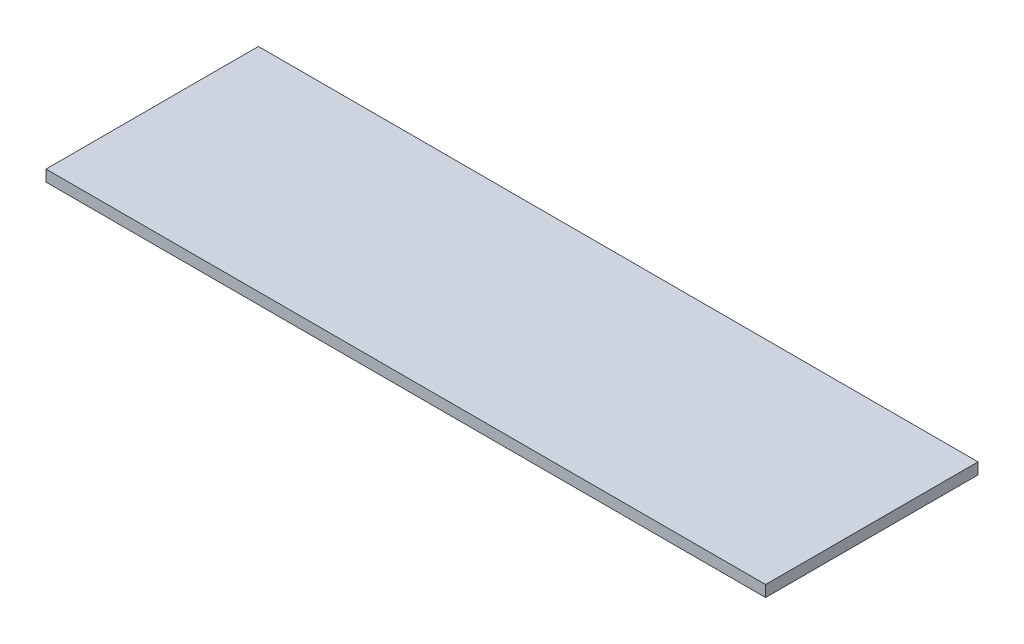
ISO-10303-21;
HEADER;
FILE_DESCRIPTION(('STEP AP214'),'2;1');
FILE_NAME('part.step','',(''),(''),'','','');
FILE_SCHEMA(('AUTOMOTIVE_DESIGN { 1 0 10303 214 1 1 1 1 }'));
ENDSEC;
DATA;
#1=APPLICATION_CONTEXT('core data for automotive mechanical design processes');
#2=APPLICATION_PROTOCOL_DEFINITION('international standard','automotive_design',2000,#1);
#3=PRODUCT_CONTEXT('',#1,'mechanical');
#4=PRODUCT('Part','Part','',(#3));
#5=PRODUCT_RELATED_PRODUCT_CATEGORY('part','',(#4));
#6=PRODUCT_DEFINITION_FORMATION('','',#4);
#7=PRODUCT_DEFINITION_CONTEXT('part definition',#1,'design');
#8=PRODUCT_DEFINITION('design','',#6,#7);
#9=PRODUCT_DEFINITION_SHAPE('','',#8);
#10=(LENGTH_UNIT() NAMED_UNIT(*) SI_UNIT(.MILLI.,.METRE.));
#11=(NAMED_UNIT(*) PLANE_ANGLE_UNIT() SI_UNIT($,.RADIAN.));
#12=(NAMED_UNIT(*) SI_UNIT($,.STERADIAN.) SOLID_ANGLE_UNIT());
#13=UNCERTAINTY_MEASURE_WITH_UNIT(LENGTH_MEASURE(1.E-05),#10,'distance_accuracy_value','');
#14=(GEOMETRIC_REPRESENTATION_CONTEXT(3) GLOBAL_UNCERTAINTY_ASSIGNED_CONTEXT((#13)) GLOBAL_UNIT_ASSIGNED_CONTEXT((#10,
#11,#12)) REPRESENTATION_CONTEXT('',''));
#15=CARTESIAN_POINT('',(0.,0.,0.));
#16=DIRECTION('',(0.,0.,1.));
#17=DIRECTION('',(1.,0.,0.));
#18=AXIS2_PLACEMENT_3D('',#15,#16,#17);
#19=CARTESIAN_POINT('',(-66.1180566751796,2.54,-8.50579229211235));
#20=DIRECTION('',(1.,0.,0.));
#21=DIRECTION('',(0.,0.,-1.));
#22=AXIS2_PLACEMENT_3D('',#19,#20,#21);
#23=PLANE('',#22);
#24=DIRECTION('',(0.,0.,1.));
#25=VECTOR('',#24,1.);
#26=CARTESIAN_POINT('',(-66.1180566751796,0.,-8.50579229211235));
#27=LINE('',#26,#25);
#28=CARTESIAN_POINT('',(-66.1180566751796,0.,-8.50579229211235));
#29=VERTEX_POINT('',#28);
#30=CARTESIAN_POINT('',(-66.1180566751795,0.,39.2287676091247));
#31=VERTEX_POINT('',#30);
#32=EDGE_CURVE('E95',#29,#31,#27,.T.);
#33=ORIENTED_EDGE('',*,*,#32,.T.);
#34=DIRECTION('',(0.,-1.,0.));
#35=VECTOR('',#34,1.);
#36=CARTESIAN_POINT('',(-66.1180566751795,2.54,39.2287676091247));
#37=LINE('',#36,#35);
#38=CARTESIAN_POINT('',(-66.1180566751795,2.54,39.2287676091247));
#39=VERTEX_POINT('',#38);
#40=EDGE_CURVE('E11',#39,#31,#37,.T.);
#41=ORIENTED_EDGE('',*,*,#40,.F.);
#42=DIRECTION('',(0.,0.,1.));
#43=VECTOR('',#42,1.);
#44=CARTESIAN_POINT('',(-66.1180566751796,2.54,-8.50579229211235));
#45=LINE('',#44,#43);
#46=CARTESIAN_POINT('',(-66.1180566751796,2.54,-8.50579229211235));
#47=VERTEX_POINT('',#46);
#48=EDGE_CURVE('E83',#47,#39,#45,.T.);
#49=ORIENTED_EDGE('',*,*,#48,.F.);
#50=DIRECTION('',(0.,-1.,0.));
#51=VECTOR('',#50,1.);
#52=CARTESIAN_POINT('',(-66.1180566751796,2.54,-8.50579229211235));
#53=LINE('',#52,#51);
#54=EDGE_CURVE('E91',#47,#29,#53,.T.);
#55=ORIENTED_EDGE('',*,*,#54,.T.);
#56=EDGE_LOOP('',(#33,#41,#49,#55));
#57=FACE_BOUND('',#56,.T.);
#58=ADVANCED_FACE('F32',(#57),#23,.F.);
#59=CARTESIAN_POINT('',(-66.1180566751795,2.54,39.2287676091247));
#60=DIRECTION('',(0.,0.,-1.));
#61=DIRECTION('',(-1.,0.,0.));
#62=AXIS2_PLACEMENT_3D('',#59,#60,#61);
#63=PLANE('',#62);
#64=DIRECTION('',(1.,0.,0.));
#65=VECTOR('',#64,1.);
#66=CARTESIAN_POINT('',(-66.1180566751795,0.,39.2287676091247));
#67=LINE('',#66,#65);
#68=CARTESIAN_POINT('',(95.5943126474986,0.,39.2287676091247));
#69=VERTEX_POINT('',#68);
#70=EDGE_CURVE('E87',#31,#69,#67,.T.);
#71=ORIENTED_EDGE('',*,*,#70,.T.);
#72=DIRECTION('',(0.,-1.,0.));
#73=VECTOR('',#72,1.);
#74=CARTESIAN_POINT('',(95.5943126474986,2.54,39.2287676091247));
#75=LINE('',#74,#73);
#76=CARTESIAN_POINT('',(95.5943126474986,2.54,39.2287676091247));
#77=VERTEX_POINT('',#76);
#78=EDGE_CURVE('E40',#77,#69,#75,.T.);
#79=ORIENTED_EDGE('',*,*,#78,.F.);
#80=DIRECTION('',(1.,0.,0.));
#81=VECTOR('',#80,1.);
#82=CARTESIAN_POINT('',(-66.1180566751795,2.54,39.2287676091247));
#83=LINE('',#82,#81);
#84=EDGE_CURVE('E78',#39,#77,#83,.T.);
#85=ORIENTED_EDGE('',*,*,#84,.F.);
#86=ORIENTED_EDGE('',*,*,#40,.T.);
#87=EDGE_LOOP('',(#71,#79,#85,#86));
#88=FACE_BOUND('',#87,.T.);
#89=ADVANCED_FACE('F86',(#88),#63,.F.);
#90=CARTESIAN_POINT('',(95.5943126474986,2.54,-8.50579229211235));
#91=DIRECTION('',(-1.,0.,0.));
#92=DIRECTION('',(0.,0.,1.));
#93=AXIS2_PLACEMENT_3D('',#90,#91,#92);
#94=PLANE('',#93);
#95=DIRECTION('',(0.,0.,-1.));
#96=VECTOR('',#95,1.);
#97=CARTESIAN_POINT('',(95.5943126474986,0.,-8.50579229211235));
#98=LINE('',#97,#96);
#99=CARTESIAN_POINT('',(95.5943126474986,0.,-8.50579229211235));
#100=VERTEX_POINT('',#99);
#101=EDGE_CURVE('E65',#69,#100,#98,.T.);
#102=ORIENTED_EDGE('',*,*,#101,.T.);
#103=DIRECTION('',(0.,-1.,0.));
#104=VECTOR('',#103,1.);
#105=CARTESIAN_POINT('',(95.5943126474986,2.54,-8.50579229211235));
#106=LINE('',#105,#104);
#107=CARTESIAN_POINT('',(95.5943126474986,2.54,-8.50579229211235));
#108=VERTEX_POINT('',#107);
#109=EDGE_CURVE('E88',#108,#100,#106,.T.);
#110=ORIENTED_EDGE('',*,*,#109,.F.);
#111=DIRECTION('',(0.,0.,-1.));
#112=VECTOR('',#111,1.);
#113=CARTESIAN_POINT('',(95.5943126474986,2.54,-8.50579229211235));
#114=LINE('',#113,#112);
#115=EDGE_CURVE('E81',#77,#108,#114,.T.);
#116=ORIENTED_EDGE('',*,*,#115,.F.);
#117=ORIENTED_EDGE('',*,*,#78,.T.);
#118=EDGE_LOOP('',(#102,#110,#116,#117));
#119=FACE_BOUND('',#118,.T.);
#120=ADVANCED_FACE('F89',(#119),#94,.F.);
#121=CARTESIAN_POINT('',(-66.1180566751796,2.54,-8.50579229211235));
#122=DIRECTION('',(0.,0.,1.));
#123=DIRECTION('',(1.,0.,0.));
#124=AXIS2_PLACEMENT_3D('',#121,#122,#123);
#125=PLANE('',#124);
#126=DIRECTION('',(-1.,0.,0.));
#127=VECTOR('',#126,1.);
#128=CARTESIAN_POINT('',(-66.1180566751796,0.,-8.50579229211235));
#129=LINE('',#128,#127);
#130=EDGE_CURVE('E71',#100,#29,#129,.T.);
#131=ORIENTED_EDGE('',*,*,#130,.T.);
#132=ORIENTED_EDGE('',*,*,#54,.F.);
#133=DIRECTION('',(-1.,0.,0.));
#134=VECTOR('',#133,1.);
#135=CARTESIAN_POINT('',(-66.1180566751796,2.54,-8.50579229211235));
#136=LINE('',#135,#134);
#137=EDGE_CURVE('E48',#108,#47,#136,.T.);
#138=ORIENTED_EDGE('',*,*,#137,.F.);
#139=ORIENTED_EDGE('',*,*,#109,.T.);
#140=EDGE_LOOP('',(#131,#132,#138,#139));
#141=FACE_BOUND('',#140,.T.);
#142=ADVANCED_FACE('F102',(#141),#125,.F.);
#143=CARTESIAN_POINT('',(-66.1180566751795,2.54,39.2287676091247));
#144=DIRECTION('',(0.,1.,0.));
#145=DIRECTION('',(0.,0.,1.));
#146=AXIS2_PLACEMENT_3D('',#143,#144,#145);
#147=PLANE('',#146);
#148=ORIENTED_EDGE('',*,*,#48,.T.);
#149=ORIENTED_EDGE('',*,*,#84,.T.);
#150=ORIENTED_EDGE('',*,*,#115,.T.);
#151=ORIENTED_EDGE('',*,*,#137,.T.);
#152=EDGE_LOOP('',(#148,#149,#150,#151));
#153=FACE_BOUND('',#152,.T.);
#154=ADVANCED_FACE('F79',(#153),#147,.T.);
#155=CARTESIAN_POINT('',(-66.1180566751795,0.,39.2287676091247));
#156=DIRECTION('',(0.,1.,0.));
#157=DIRECTION('',(0.,0.,1.));
#158=AXIS2_PLACEMENT_3D('',#155,#156,#157);
#159=PLANE('',#158);
#160=ORIENTED_EDGE('',*,*,#32,.F.);
#161=ORIENTED_EDGE('',*,*,#130,.F.);
#162=ORIENTED_EDGE('',*,*,#101,.F.);
#163=ORIENTED_EDGE('',*,*,#70,.F.);
#164=EDGE_LOOP('',(#160,#161,#162,#163));
#165=FACE_BOUND('',#164,.T.);
#166=ADVANCED_FACE('F105',(#165),#159,.F.);
#167=CLOSED_SHELL('',(#58,#89,#120,#142,#154,#166));
#168=MANIFOLD_SOLID_BREP('B2',#167);
#169=ADVANCED_BREP_SHAPE_REPRESENTATION('',(#18,#168),#14);
#170=SHAPE_DEFINITION_REPRESENTATION(#9,#169);
ENDSEC;
END-ISO-10303-21;
